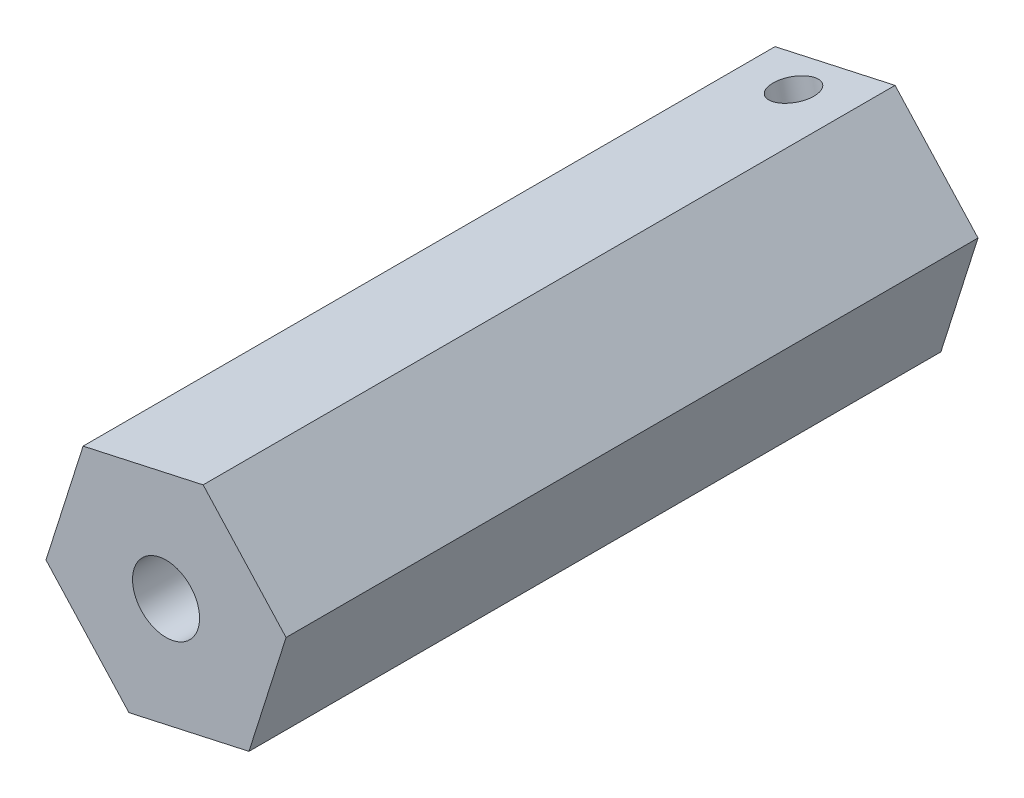
ISO-10303-21;
HEADER;
FILE_DESCRIPTION(('STEP AP214'),'2;1');
FILE_NAME('part.step','',(''),(''),'','','');
FILE_SCHEMA(('AUTOMOTIVE_DESIGN { 1 0 10303 214 1 1 1 1 }'));
ENDSEC;
DATA;
#1=APPLICATION_CONTEXT('core data for automotive mechanical design processes');
#2=APPLICATION_PROTOCOL_DEFINITION('international standard','automotive_design',2000,#1);
#3=PRODUCT_CONTEXT('',#1,'mechanical');
#4=PRODUCT('Part','Part','',(#3));
#5=PRODUCT_RELATED_PRODUCT_CATEGORY('part','',(#4));
#6=PRODUCT_DEFINITION_FORMATION('','',#4);
#7=PRODUCT_DEFINITION_CONTEXT('part definition',#1,'design');
#8=PRODUCT_DEFINITION('design','',#6,#7);
#9=PRODUCT_DEFINITION_SHAPE('','',#8);
#10=(LENGTH_UNIT() NAMED_UNIT(*) SI_UNIT(.MILLI.,.METRE.));
#11=(NAMED_UNIT(*) PLANE_ANGLE_UNIT() SI_UNIT($,.RADIAN.));
#12=(NAMED_UNIT(*) SI_UNIT($,.STERADIAN.) SOLID_ANGLE_UNIT());
#13=UNCERTAINTY_MEASURE_WITH_UNIT(LENGTH_MEASURE(1.E-05),#10,'distance_accuracy_value','');
#14=(GEOMETRIC_REPRESENTATION_CONTEXT(3) GLOBAL_UNCERTAINTY_ASSIGNED_CONTEXT((#13)) GLOBAL_UNIT_ASSIGNED_CONTEXT((#10,
#11,#12)) REPRESENTATION_CONTEXT('',''));
#15=CARTESIAN_POINT('',(0.,0.,0.));
#16=DIRECTION('',(0.,0.,1.));
#17=DIRECTION('',(1.,0.,0.));
#18=AXIS2_PLACEMENT_3D('',#15,#16,#17);
#19=CARTESIAN_POINT('',(0.,0.,41.275));
#20=DIRECTION('',(0.,0.,1.));
#21=DIRECTION('',(1.,0.,0.));
#22=AXIS2_PLACEMENT_3D('',#19,#20,#21);
#23=PLANE('',#22);
#24=DIRECTION('',(-0.674708732964743,0.73808409118549,0.));
#25=VECTOR('',#24,1.);
#26=CARTESIAN_POINT('',(7.16043373464911,1.57845559488726,41.275));
#27=LINE('',#26,#25);
#28=CARTESIAN_POINT('',(7.16043373464911,1.57845559488726,41.275));
#29=VERTEX_POINT('',#28);
#30=CARTESIAN_POINT('',(2.2132342234065,6.99034531376483,41.275));
#31=VERTEX_POINT('',#30);
#32=EDGE_CURVE('E137',#29,#31,#27,.T.);
#33=ORIENTED_EDGE('',*,*,#32,.T.);
#34=DIRECTION('',(-0.976553939578157,-0.215272857309932,0.));
#35=VECTOR('',#34,1.);
#36=CARTESIAN_POINT('',(2.2132342234065,6.99034531376483,41.275));
#37=LINE('',#36,#35);
#38=CARTESIAN_POINT('',(-4.9471995112426,5.41188971887757,41.275));
#39=VERTEX_POINT('',#38);
#40=EDGE_CURVE('E95',#31,#39,#37,.T.);
#41=ORIENTED_EDGE('',*,*,#40,.T.);
#42=DIRECTION('',(-0.301845206613414,-0.953356948495423,0.));
#43=VECTOR('',#42,1.);
#44=CARTESIAN_POINT('',(-4.9471995112426,5.41188971887757,41.275));
#45=LINE('',#44,#43);
#46=CARTESIAN_POINT('',(-7.1604337346491,-1.57845559488727,41.275));
#47=VERTEX_POINT('',#46);
#48=EDGE_CURVE('E108',#39,#47,#45,.T.);
#49=ORIENTED_EDGE('',*,*,#48,.T.);
#50=DIRECTION('',(0.674708732964742,-0.738084091185491,0.));
#51=VECTOR('',#50,1.);
#52=CARTESIAN_POINT('',(-7.1604337346491,-1.57845559488727,41.275));
#53=LINE('',#52,#51);
#54=CARTESIAN_POINT('',(-2.2132342234065,-6.99034531376483,41.275));
#55=VERTEX_POINT('',#54);
#56=EDGE_CURVE('E102',#47,#55,#53,.T.);
#57=ORIENTED_EDGE('',*,*,#56,.T.);
#58=DIRECTION('',(0.976553939578157,0.215272857309932,0.));
#59=VECTOR('',#58,1.);
#60=CARTESIAN_POINT('',(-2.2132342234065,-6.99034531376483,41.275));
#61=LINE('',#60,#59);
#62=CARTESIAN_POINT('',(4.94719951124262,-5.41188971887757,41.275));
#63=VERTEX_POINT('',#62);
#64=EDGE_CURVE('E106',#55,#63,#61,.T.);
#65=ORIENTED_EDGE('',*,*,#64,.T.);
#66=DIRECTION('',(0.301845206613414,0.953356948495423,0.));
#67=VECTOR('',#66,1.);
#68=CARTESIAN_POINT('',(4.94719951124262,-5.41188971887757,41.275));
#69=LINE('',#68,#67);
#70=EDGE_CURVE('E58',#63,#29,#69,.T.);
#71=ORIENTED_EDGE('',*,*,#70,.T.);
#72=EDGE_LOOP('',(#33,#41,#49,#57,#65,#71));
#73=FACE_BOUND('',#72,.T.);
#74=CARTESIAN_POINT('',(0.,0.,41.275));
#75=DIRECTION('',(0.,0.,1.));
#76=DIRECTION('',(1.,0.,0.));
#77=AXIS2_PLACEMENT_3D('',#74,#75,#76);
#78=CIRCLE('',#77,2.00000108);
#79=CARTESIAN_POINT('',(2.00000108,0.,41.275));
#80=VERTEX_POINT('',#79);
#81=EDGE_CURVE('E130',#80,#80,#78,.T.);
#82=ORIENTED_EDGE('',*,*,#81,.F.);
#83=EDGE_LOOP('',(#82));
#84=FACE_BOUND('',#83,.T.);
#85=ADVANCED_FACE('F36',(#73,#84),#23,.T.);
#86=CARTESIAN_POINT('',(0.,0.,0.));
#87=DIRECTION('',(0.,0.,1.));
#88=DIRECTION('',(1.,0.,0.));
#89=AXIS2_PLACEMENT_3D('',#86,#87,#88);
#90=PLANE('',#89);
#91=DIRECTION('',(-0.674708732964743,0.73808409118549,0.));
#92=VECTOR('',#91,1.);
#93=CARTESIAN_POINT('',(7.16043373464911,1.57845559488726,0.));
#94=LINE('',#93,#92);
#95=CARTESIAN_POINT('',(7.16043373464911,1.57845559488726,0.));
#96=VERTEX_POINT('',#95);
#97=CARTESIAN_POINT('',(2.2132342234065,6.99034531376483,0.));
#98=VERTEX_POINT('',#97);
#99=EDGE_CURVE('E126',#96,#98,#94,.T.);
#100=ORIENTED_EDGE('',*,*,#99,.F.);
#101=DIRECTION('',(0.301845206613414,0.953356948495423,0.));
#102=VECTOR('',#101,1.);
#103=CARTESIAN_POINT('',(4.94719951124262,-5.41188971887757,0.));
#104=LINE('',#103,#102);
#105=CARTESIAN_POINT('',(4.94719951124262,-5.41188971887757,0.));
#106=VERTEX_POINT('',#105);
#107=EDGE_CURVE('E87',#106,#96,#104,.T.);
#108=ORIENTED_EDGE('',*,*,#107,.F.);
#109=DIRECTION('',(0.976553939578157,0.215272857309932,0.));
#110=VECTOR('',#109,1.);
#111=CARTESIAN_POINT('',(-2.2132342234065,-6.99034531376483,0.));
#112=LINE('',#111,#110);
#113=CARTESIAN_POINT('',(-2.2132342234065,-6.99034531376483,0.));
#114=VERTEX_POINT('',#113);
#115=EDGE_CURVE('E81',#114,#106,#112,.T.);
#116=ORIENTED_EDGE('',*,*,#115,.F.);
#117=DIRECTION('',(0.674708732964742,-0.738084091185491,0.));
#118=VECTOR('',#117,1.);
#119=CARTESIAN_POINT('',(-7.1604337346491,-1.57845559488727,0.));
#120=LINE('',#119,#118);
#121=CARTESIAN_POINT('',(-7.1604337346491,-1.57845559488727,0.));
#122=VERTEX_POINT('',#121);
#123=EDGE_CURVE('E116',#122,#114,#120,.T.);
#124=ORIENTED_EDGE('',*,*,#123,.F.);
#125=DIRECTION('',(-0.301845206613414,-0.953356948495423,0.));
#126=VECTOR('',#125,1.);
#127=CARTESIAN_POINT('',(-4.9471995112426,5.41188971887757,0.));
#128=LINE('',#127,#126);
#129=CARTESIAN_POINT('',(-4.9471995112426,5.41188971887757,0.));
#130=VERTEX_POINT('',#129);
#131=EDGE_CURVE('E132',#130,#122,#128,.T.);
#132=ORIENTED_EDGE('',*,*,#131,.F.);
#133=DIRECTION('',(-0.976553939578157,-0.215272857309932,0.));
#134=VECTOR('',#133,1.);
#135=CARTESIAN_POINT('',(2.2132342234065,6.99034531376483,0.));
#136=LINE('',#135,#134);
#137=EDGE_CURVE('E129',#98,#130,#136,.T.);
#138=ORIENTED_EDGE('',*,*,#137,.F.);
#139=EDGE_LOOP('',(#100,#108,#116,#124,#132,#138));
#140=FACE_BOUND('',#139,.T.);
#141=CARTESIAN_POINT('',(0.,0.,0.));
#142=DIRECTION('',(0.,0.,1.));
#143=DIRECTION('',(1.,0.,0.));
#144=AXIS2_PLACEMENT_3D('',#141,#142,#143);
#145=CIRCLE('',#144,2.00000108);
#146=CARTESIAN_POINT('',(2.00000108,0.,0.));
#147=VERTEX_POINT('',#146);
#148=EDGE_CURVE('E183',#147,#147,#145,.T.);
#149=ORIENTED_EDGE('',*,*,#148,.T.);
#150=EDGE_LOOP('',(#149));
#151=FACE_BOUND('',#150,.T.);
#152=ADVANCED_FACE('F147',(#140,#151),#90,.F.);
#153=CARTESIAN_POINT('',(7.16043373464911,1.57845559488726,41.275));
#154=DIRECTION('',(-0.73808409118549,-0.674708732964743,0.));
#155=DIRECTION('',(0.674708732964743,-0.73808409118549,0.));
#156=AXIS2_PLACEMENT_3D('',#153,#154,#155);
#157=PLANE('',#156);
#158=ORIENTED_EDGE('',*,*,#99,.T.);
#159=DIRECTION('',(0.,0.,-1.));
#160=VECTOR('',#159,1.);
#161=CARTESIAN_POINT('',(2.2132342234065,6.99034531376483,41.275));
#162=LINE('',#161,#160);
#163=EDGE_CURVE('E11',#31,#98,#162,.T.);
#164=ORIENTED_EDGE('',*,*,#163,.F.);
#165=ORIENTED_EDGE('',*,*,#32,.F.);
#166=DIRECTION('',(0.,0.,-1.));
#167=VECTOR('',#166,1.);
#168=CARTESIAN_POINT('',(7.16043373464911,1.57845559488726,41.275));
#169=LINE('',#168,#167);
#170=EDGE_CURVE('E122',#29,#96,#169,.T.);
#171=ORIENTED_EDGE('',*,*,#170,.T.);
#172=EDGE_LOOP('',(#158,#164,#165,#171));
#173=FACE_BOUND('',#172,.T.);
#174=ADVANCED_FACE('F38',(#173),#157,.F.);
#175=CARTESIAN_POINT('',(2.2132342234065,6.99034531376483,41.275));
#176=DIRECTION('',(0.215272857309932,-0.976553939578157,0.));
#177=DIRECTION('',(0.976553939578157,0.215272857309932,0.));
#178=AXIS2_PLACEMENT_3D('',#175,#176,#177);
#179=PLANE('',#178);
#180=CARTESIAN_POINT('',(-1.39468373326683,6.19501105111428,2.44845097487718));
#181=DIRECTION('',(-0.215272857309932,0.976553939578157,0.));
#182=DIRECTION('',(-0.976553939578157,-0.215272857309932,0.));
#183=AXIS2_PLACEMENT_3D('',#180,#181,#182);
#184=CIRCLE('',#183,1.25);
#185=CARTESIAN_POINT('',(-2.61537615773952,5.92591997947687,2.44845097487718));
#186=VERTEX_POINT('',#185);
#187=EDGE_CURVE('E180',#186,#186,#184,.T.);
#188=ORIENTED_EDGE('',*,*,#187,.F.);
#189=EDGE_LOOP('',(#188));
#190=FACE_BOUND('',#189,.T.);
#191=ORIENTED_EDGE('',*,*,#137,.T.);
#192=DIRECTION('',(0.,0.,-1.));
#193=VECTOR('',#192,1.);
#194=CARTESIAN_POINT('',(-4.9471995112426,5.41188971887757,41.275));
#195=LINE('',#194,#193);
#196=EDGE_CURVE('E50',#39,#130,#195,.T.);
#197=ORIENTED_EDGE('',*,*,#196,.F.);
#198=ORIENTED_EDGE('',*,*,#40,.F.);
#199=ORIENTED_EDGE('',*,*,#163,.T.);
#200=EDGE_LOOP('',(#191,#197,#198,#199));
#201=FACE_BOUND('',#200,.T.);
#202=ADVANCED_FACE('F194',(#190,#201),#179,.F.);
#203=CARTESIAN_POINT('',(-4.9471995112426,5.41188971887757,41.275));
#204=DIRECTION('',(0.953356948495423,-0.301845206613414,0.));
#205=DIRECTION('',(0.301845206613414,0.953356948495423,0.));
#206=AXIS2_PLACEMENT_3D('',#203,#204,#205);
#207=PLANE('',#206);
#208=ORIENTED_EDGE('',*,*,#131,.T.);
#209=DIRECTION('',(0.,0.,-1.));
#210=VECTOR('',#209,1.);
#211=CARTESIAN_POINT('',(-7.1604337346491,-1.57845559488727,41.275));
#212=LINE('',#211,#210);
#213=EDGE_CURVE('E117',#47,#122,#212,.T.);
#214=ORIENTED_EDGE('',*,*,#213,.F.);
#215=ORIENTED_EDGE('',*,*,#48,.F.);
#216=ORIENTED_EDGE('',*,*,#196,.T.);
#217=EDGE_LOOP('',(#208,#214,#215,#216));
#218=FACE_BOUND('',#217,.T.);
#219=ADVANCED_FACE('F144',(#218),#207,.F.);
#220=CARTESIAN_POINT('',(-7.1604337346491,-1.57845559488727,41.275));
#221=DIRECTION('',(0.738084091185491,0.674708732964742,0.));
#222=DIRECTION('',(-0.674708732964742,0.738084091185491,0.));
#223=AXIS2_PLACEMENT_3D('',#220,#221,#222);
#224=PLANE('',#223);
#225=ORIENTED_EDGE('',*,*,#123,.T.);
#226=DIRECTION('',(0.,0.,-1.));
#227=VECTOR('',#226,1.);
#228=CARTESIAN_POINT('',(-2.2132342234065,-6.99034531376483,41.275));
#229=LINE('',#228,#227);
#230=EDGE_CURVE('E113',#55,#114,#229,.T.);
#231=ORIENTED_EDGE('',*,*,#230,.F.);
#232=ORIENTED_EDGE('',*,*,#56,.F.);
#233=ORIENTED_EDGE('',*,*,#213,.T.);
#234=EDGE_LOOP('',(#225,#231,#232,#233));
#235=FACE_BOUND('',#234,.T.);
#236=ADVANCED_FACE('F114',(#235),#224,.F.);
#237=CARTESIAN_POINT('',(-2.2132342234065,-6.99034531376483,41.275));
#238=DIRECTION('',(-0.215272857309932,0.976553939578157,0.));
#239=DIRECTION('',(-0.976553939578157,-0.215272857309932,0.));
#240=AXIS2_PLACEMENT_3D('',#237,#238,#239);
#241=PLANE('',#240);
#242=ORIENTED_EDGE('',*,*,#115,.T.);
#243=DIRECTION('',(0.,0.,-1.));
#244=VECTOR('',#243,1.);
#245=CARTESIAN_POINT('',(4.94719951124262,-5.41188971887757,41.275));
#246=LINE('',#245,#244);
#247=EDGE_CURVE('E118',#63,#106,#246,.T.);
#248=ORIENTED_EDGE('',*,*,#247,.F.);
#249=ORIENTED_EDGE('',*,*,#64,.F.);
#250=ORIENTED_EDGE('',*,*,#230,.T.);
#251=EDGE_LOOP('',(#242,#248,#249,#250));
#252=FACE_BOUND('',#251,.T.);
#253=ADVANCED_FACE('F120',(#252),#241,.F.);
#254=CARTESIAN_POINT('',(4.94719951124262,-5.41188971887757,41.275));
#255=DIRECTION('',(-0.953356948495423,0.301845206613414,0.));
#256=DIRECTION('',(-0.301845206613414,-0.953356948495423,0.));
#257=AXIS2_PLACEMENT_3D('',#254,#255,#256);
#258=PLANE('',#257);
#259=ORIENTED_EDGE('',*,*,#107,.T.);
#260=ORIENTED_EDGE('',*,*,#170,.F.);
#261=ORIENTED_EDGE('',*,*,#70,.F.);
#262=ORIENTED_EDGE('',*,*,#247,.T.);
#263=EDGE_LOOP('',(#259,#260,#261,#262));
#264=FACE_BOUND('',#263,.T.);
#265=ADVANCED_FACE('F152',(#264),#258,.F.);
#266=CARTESIAN_POINT('',(0.,0.,41.275));
#267=DIRECTION('',(0.,0.,-1.));
#268=DIRECTION('',(-1.,0.,0.));
#269=AXIS2_PLACEMENT_3D('',#266,#267,#268);
#270=CYLINDRICAL_SURFACE('',#269,2.00000108);
#271=CARTESIAN_POINT('',(-1.57950698121835,1.22685044576903,2.44845097487718));
#272=CARTESIAN_POINT('',(-1.57950357108747,1.22686010947027,2.38678571713155));
#273=CARTESIAN_POINT('',(-1.57584047756612,1.2316160544826,2.32502124020835));
#274=CARTESIAN_POINT('',(-1.56137439662695,1.24989559154134,2.20360006244576));
#275=CARTESIAN_POINT('',(-1.55055134640311,1.2634438182717,2.14394978202833));
#276=CARTESIAN_POINT('',(-1.52233956424308,1.2972902312983,2.02890392129804));
#277=CARTESIAN_POINT('',(-1.50501056859505,1.3175268100541,1.97347498936659));
#278=CARTESIAN_POINT('',(-1.46418526668207,1.36275178959893,1.86706760194282));
#279=CARTESIAN_POINT('',(-1.4406889168242,1.38774022397531,1.81608917791158));
#280=CARTESIAN_POINT('',(-1.38404794559656,1.44438014909659,1.71216514038334));
#281=CARTESIAN_POINT('',(-1.35001228999792,1.47647460503128,1.65994653394831));
#282=CARTESIAN_POINT('',(-1.27437313415582,1.54223678200592,1.56236793297102));
#283=CARTESIAN_POINT('',(-1.23276275347321,1.57590591255645,1.51701424328375));
#284=CARTESIAN_POINT('',(-1.1360645666276,1.6472492451045,1.42846447302335));
#285=CARTESIAN_POINT('',(-1.07992074536875,1.6848614414629,1.38635504871635));
#286=CARTESIAN_POINT('',(-0.958671227891423,1.75667311106495,1.31366529690675));
#287=CARTESIAN_POINT('',(-0.893574061896558,1.79087577983882,1.2830740979798));
#288=CARTESIAN_POINT('',(-0.762762996572252,1.85008851003505,1.23761692901287));
#289=CARTESIAN_POINT('',(-0.697751967549202,1.87567409598456,1.22149127411802));
#290=CARTESIAN_POINT('',(-0.563733320574717,1.9202015858608,1.20118016223887));
#291=CARTESIAN_POINT('',(-0.494730367001514,1.93915106810946,1.19698104610335));
#292=CARTESIAN_POINT('',(-0.365241845470897,1.96732563776251,1.20057169615621));
#293=CARTESIAN_POINT('',(-0.304919303867096,1.97754195494568,1.20676232199186));
#294=CARTESIAN_POINT('',(-0.185128079929509,1.99232842602406,1.22788425884999));
#295=CARTESIAN_POINT('',(-0.125659443171859,1.99689827964515,1.24281603465717));
#296=CARTESIAN_POINT('',(-0.00948648176761168,2.00082018032558,1.28064599254245));
#297=CARTESIAN_POINT('',(0.0472296893608954,2.0001970448443,1.30350578418841));
#298=CARTESIAN_POINT('',(0.156971270336299,1.99458946386211,1.35636956554372));
#299=CARTESIAN_POINT('',(0.209995853925298,1.98960404535334,1.38637514803593));
#300=CARTESIAN_POINT('',(0.317511147600664,1.97546731626248,1.45671090392948));
#301=CARTESIAN_POINT('',(0.371417453956611,1.96588873808312,1.49784705238962));
#302=CARTESIAN_POINT('',(0.472479884661567,1.94407987855758,1.58720260886074));
#303=CARTESIAN_POINT('',(0.519626609474931,1.93184596309483,1.63543169486638));
#304=CARTESIAN_POINT('',(0.611708091728585,1.90483641442138,1.74489102351293));
#305=CARTESIAN_POINT('',(0.655575263745088,1.88993638498586,1.80699574349456));
#306=CARTESIAN_POINT('',(0.731553584224361,1.86184863355978,1.93836070699709));
#307=CARTESIAN_POINT('',(0.763684084029457,1.84865811632394,2.00760892833484));
#308=CARTESIAN_POINT('',(0.807803556559931,1.8297229898971,2.13393986573646));
#309=CARTESIAN_POINT('',(0.822805208843497,1.82294442475982,2.18981311550709));
#310=CARTESIAN_POINT('',(0.843979499509284,1.81324121435989,2.30350867849121));
#311=CARTESIAN_POINT('',(0.850163775383377,1.81031148966097,2.36132831936125));
#312=CARTESIAN_POINT('',(0.853256990832517,1.80885622932089,2.47740373733819));
#313=CARTESIAN_POINT('',(0.850145346092688,1.81034046765496,2.53566019698677));
#314=CARTESIAN_POINT('',(0.834848847970632,1.81744285541744,2.65072502641561));
#315=CARTESIAN_POINT('',(0.822656838829158,1.82306426509238,2.70753221756801));
#316=CARTESIAN_POINT('',(0.790292649334283,1.83731979849574,2.81734014657956));
#317=CARTESIAN_POINT('',(0.770255644321916,1.84590261209995,2.87038826736126));
#318=CARTESIAN_POINT('',(0.723149132185829,1.86486003970937,2.97289597814618));
#319=CARTESIAN_POINT('',(0.696077074789173,1.8752353030364,3.02235425846323));
#320=CARTESIAN_POINT('',(0.630254490425208,1.89847569247494,3.12583229474847));
#321=CARTESIAN_POINT('',(0.590275529431127,1.91145052302713,3.17904627927224));
#322=CARTESIAN_POINT('',(0.502778244652458,1.93630866122156,3.27921273153606));
#323=CARTESIAN_POINT('',(0.455252359414963,1.94819085506634,3.32615883155216));
#324=CARTESIAN_POINT('',(0.346122009357162,1.97072141199632,3.41946084083232));
#325=CARTESIAN_POINT('',(0.283474990945195,1.98093209915516,3.46471693273241));
#326=CARTESIAN_POINT('',(0.151071370561196,1.99539620118083,3.54457737095186));
#327=CARTESIAN_POINT('',(0.0813188285382187,1.99965299772128,3.57918775506771));
#328=CARTESIAN_POINT('',(-0.0583638282358505,2.00028620223849,3.63417660846182));
#329=CARTESIAN_POINT('',(-0.12797662500555,1.99716554064625,3.65534542577918));
#330=CARTESIAN_POINT('',(-0.268990274095954,1.98309005644325,3.68561355826834));
#331=CARTESIAN_POINT('',(-0.340388707536859,1.97214533092566,3.69472838616487));
#332=CARTESIAN_POINT('',(-0.471892545748332,1.9445264964968,3.69991840025703));
#333=CARTESIAN_POINT('',(-0.532157353833623,1.92889108945291,3.69766666913553));
#334=CARTESIAN_POINT('',(-0.650019773140509,1.89242733756891,3.68405303926301));
#335=CARTESIAN_POINT('',(-0.70761740656777,1.87159903597166,3.67269121637286));
#336=CARTESIAN_POINT('',(-0.817234771860297,1.82635244330754,3.64188009655346));
#337=CARTESIAN_POINT('',(-0.869359576974609,1.802039752344,3.62264537131086));
#338=CARTESIAN_POINT('',(-0.968783438577776,1.75059976437562,3.57691719835855));
#339=CARTESIAN_POINT('',(-1.01608163621828,1.72347196817598,3.55042246187996));
#340=CARTESIAN_POINT('',(-1.11027545568847,1.6645446002538,3.48770617884696));
#341=CARTESIAN_POINT('',(-1.15655408358037,1.63255942785244,3.4507351244279));
#342=CARTESIAN_POINT('',(-1.2423045938101,1.56829894762047,3.36974450709751));
#343=CARTESIAN_POINT('',(-1.28176813529504,1.53602333442083,3.32571643247326));
#344=CARTESIAN_POINT('',(-1.35901029028141,1.46836585284814,3.22439033069197));
#345=CARTESIAN_POINT('',(-1.39569390309742,1.43322219225105,3.16609316439516));
#346=CARTESIAN_POINT('',(-1.45963633836497,1.3680465362937,3.04191524086369));
#347=CARTESIAN_POINT('',(-1.48690188475868,1.33801090191482,2.97603993894769));
#348=CARTESIAN_POINT('',(-1.52614104114067,1.2928924025447,2.85420945812403));
#349=CARTESIAN_POINT('',(-1.54020892116964,1.27595234088345,2.79961752808372));
#350=CARTESIAN_POINT('',(-1.56212213943346,1.24903463287656,2.68762416253409));
#351=CARTESIAN_POINT('',(-1.56998759026476,1.23903449522155,2.63023245412218));
#352=CARTESIAN_POINT('',(-1.57623446044343,1.23105391048666,2.5517133506004));
#353=CARTESIAN_POINT('',(-1.57746005559077,1.2294821334301,2.53111693945059));
#354=CARTESIAN_POINT('',(-1.57909699231267,1.22737864640849,2.48983441735342));
#355=CARTESIAN_POINT('',(-1.57950812579372,1.22684720224704,2.46914828483505));
#356=CARTESIAN_POINT('',(-1.57950698121835,1.22685044576903,2.44845097487718));
#357=B_SPLINE_CURVE_WITH_KNOTS('',3,(#271,#272,#273,#274,#275,#276,#277,#278,#279,#280,#281,
#282,#283,#284,#285,#286,#287,#288,#289,#290,#291,#292,#293,#294,#295,#296,#297,#298,#299,#300,
#301,#302,#303,#304,#305,#306,#307,#308,#309,#310,#311,#312,#313,#314,#315,#316,#317,#318,#319,
#320,#321,#322,#323,#324,#325,#326,#327,#328,#329,#330,#331,#332,#333,#334,#335,#336,#337,#338,
#339,#340,#341,#342,#343,#344,#345,#346,#347,#348,#349,#350,#351,#352,#353,#354,#355,#356),
.UNSPECIFIED.,.T.,.F.,(4,2,2,2,2,2,2,2,2,2,2,2,2,2,2,2,2,2,2,2,2,2,2,2,2,2,2,2,2,2,2,2,2,2,2,2,
2,2,2,2,2,2,4),(0.,0.184899520579609,0.370319352335958,0.554076755687074,0.737835457931731,
0.947368651451641,1.15709313113597,1.39467308735243,1.63202823932873,1.84581860344609,
2.05936402015775,2.24295383580528,2.42655341418331,2.60927606936743,2.79203949125861,
2.99668226750752,3.2016069057309,3.43293363349734,3.66387721116595,3.83788704278131,
4.01166699665882,4.1858320431927,4.36013448548809,4.53155712735672,4.70304199845155,
4.90570780441455,5.10857796262378,5.34125030862924,5.57379044832811,5.79093948613894,
6.00780879398959,6.19377377448055,6.37973720643438,6.56093812403677,6.74217122858107,
6.94334672114691,7.14476670995303,7.37571269879223,7.60649346340768,7.78242602632004,
7.9577857200512,8.01982949368042,8.08188911733891),.UNSPECIFIED.);
#358=CARTESIAN_POINT('',(-1.57950698121835,1.22685044576903,2.44845097487718));
#359=VERTEX_POINT('',#358);
#360=EDGE_CURVE('E40',#359,#359,#357,.T.);
#361=ORIENTED_EDGE('',*,*,#360,.F.);
#362=EDGE_LOOP('',(#361));
#363=FACE_BOUND('',#362,.T.);
#364=ORIENTED_EDGE('',*,*,#81,.T.);
#365=EDGE_LOOP('',(#364));
#366=FACE_BOUND('',#365,.T.);
#367=ORIENTED_EDGE('',*,*,#148,.F.);
#368=EDGE_LOOP('',(#367));
#369=FACE_BOUND('',#368,.T.);
#370=ADVANCED_FACE('F154',(#363,#366,#369),#270,.F.);
#371=CARTESIAN_POINT('',(-1.39468373326683,6.19501105111428,2.44845097487718));
#372=DIRECTION('',(-0.215272857309932,0.976553939578157,0.));
#373=DIRECTION('',(-0.976553939578157,-0.215272857309932,0.));
#374=AXIS2_PLACEMENT_3D('',#371,#372,#373);
#375=CYLINDRICAL_SURFACE('',#374,1.25);
#376=ORIENTED_EDGE('',*,*,#360,.T.);
#377=EDGE_LOOP('',(#376));
#378=FACE_BOUND('',#377,.T.);
#379=ORIENTED_EDGE('',*,*,#187,.T.);
#380=EDGE_LOOP('',(#379));
#381=FACE_BOUND('',#380,.T.);
#382=ADVANCED_FACE('F160',(#378,#381),#375,.F.);
#383=CLOSED_SHELL('',(#85,#152,#174,#202,#219,#236,#253,#265,#370,#382));
#384=MANIFOLD_SOLID_BREP('B2',#383);
#385=ADVANCED_BREP_SHAPE_REPRESENTATION('',(#18,#384),#14);
#386=SHAPE_DEFINITION_REPRESENTATION(#9,#385);
ENDSEC;
END-ISO-10303-21;
